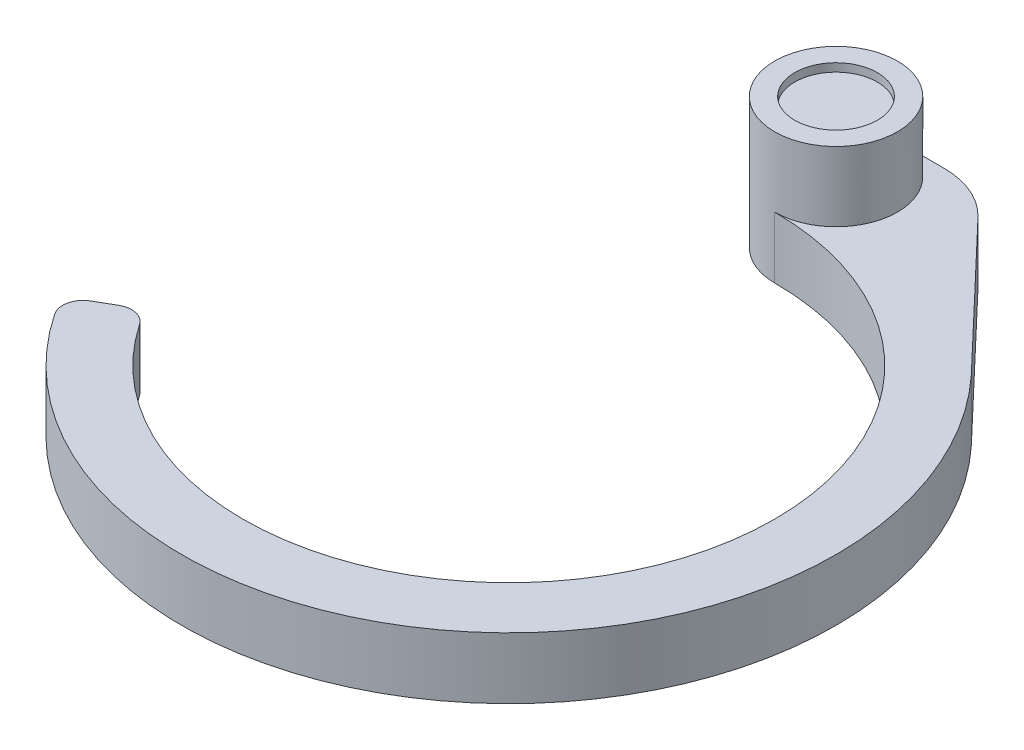
ISO-10303-21;
HEADER;
FILE_DESCRIPTION(('STEP AP214'),'2;1');
FILE_NAME('part.step','',(''),(''),'','','');
FILE_SCHEMA(('AUTOMOTIVE_DESIGN { 1 0 10303 214 1 1 1 1 }'));
ENDSEC;
DATA;
#1=APPLICATION_CONTEXT('core data for automotive mechanical design processes');
#2=APPLICATION_PROTOCOL_DEFINITION('international standard','automotive_design',2000,#1);
#3=PRODUCT_CONTEXT('',#1,'mechanical');
#4=PRODUCT('Part','Part','',(#3));
#5=PRODUCT_RELATED_PRODUCT_CATEGORY('part','',(#4));
#6=PRODUCT_DEFINITION_FORMATION('','',#4);
#7=PRODUCT_DEFINITION_CONTEXT('part definition',#1,'design');
#8=PRODUCT_DEFINITION('design','',#6,#7);
#9=PRODUCT_DEFINITION_SHAPE('','',#8);
#10=(LENGTH_UNIT() NAMED_UNIT(*) SI_UNIT(.MILLI.,.METRE.));
#11=(NAMED_UNIT(*) PLANE_ANGLE_UNIT() SI_UNIT($,.RADIAN.));
#12=(NAMED_UNIT(*) SI_UNIT($,.STERADIAN.) SOLID_ANGLE_UNIT());
#13=UNCERTAINTY_MEASURE_WITH_UNIT(LENGTH_MEASURE(1.E-05),#10,'distance_accuracy_value','');
#14=(GEOMETRIC_REPRESENTATION_CONTEXT(3) GLOBAL_UNCERTAINTY_ASSIGNED_CONTEXT((#13)) GLOBAL_UNIT_ASSIGNED_CONTEXT((#10,
#11,#12)) REPRESENTATION_CONTEXT('',''));
#15=CARTESIAN_POINT('',(0.,0.,0.));
#16=DIRECTION('',(0.,0.,1.));
#17=DIRECTION('',(1.,0.,0.));
#18=AXIS2_PLACEMENT_3D('',#15,#16,#17);
#19=CARTESIAN_POINT('',(-62.3074069840787,15.,41.7467008866615));
#20=DIRECTION('',(0.,-1.,0.));
#21=DIRECTION('',(0.,0.,-1.));
#22=AXIS2_PLACEMENT_3D('',#19,#20,#21);
#23=CYLINDRICAL_SURFACE('',#22,5.00000000000001);
#24=CARTESIAN_POINT('',(-62.3074069840787,0.,41.7467008866615));
#25=DIRECTION('',(0.,1.,0.));
#26=DIRECTION('',(0.,0.,1.));
#27=AXIS2_PLACEMENT_3D('',#24,#25,#26);
#28=CIRCLE('',#27,5.00000000000001);
#29=CARTESIAN_POINT('',(-66.4612341163506,0.,44.5298142791056));
#30=VERTEX_POINT('',#29);
#31=CARTESIAN_POINT('',(-64.8074069840787,0.,37.4165738677393));
#32=VERTEX_POINT('',#31);
#33=EDGE_CURVE('E176',#30,#32,#28,.F.);
#34=ORIENTED_EDGE('',*,*,#33,.F.);
#35=DIRECTION('',(0.,-1.,0.));
#36=VECTOR('',#35,1.);
#37=CARTESIAN_POINT('',(-66.4612341163506,15.,44.5298142791056));
#38=LINE('',#37,#36);
#39=CARTESIAN_POINT('',(-66.4612341163506,15.,44.5298142791056));
#40=VERTEX_POINT('',#39);
#41=EDGE_CURVE('E11',#40,#30,#38,.T.);
#42=ORIENTED_EDGE('',*,*,#41,.F.);
#43=CARTESIAN_POINT('',(-62.3074069840787,15.,41.7467008866615));
#44=DIRECTION('',(0.,1.,0.));
#45=DIRECTION('',(0.,0.,1.));
#46=AXIS2_PLACEMENT_3D('',#43,#44,#45);
#47=CIRCLE('',#46,5.00000000000001);
#48=CARTESIAN_POINT('',(-64.8074069840787,15.,37.4165738677393));
#49=VERTEX_POINT('',#48);
#50=EDGE_CURVE('E193',#40,#49,#47,.F.);
#51=ORIENTED_EDGE('',*,*,#50,.T.);
#52=DIRECTION('',(0.,-1.,0.));
#53=VECTOR('',#52,1.);
#54=CARTESIAN_POINT('',(-64.8074069840787,15.,37.4165738677393));
#55=LINE('',#54,#53);
#56=EDGE_CURVE('E91',#49,#32,#55,.T.);
#57=ORIENTED_EDGE('',*,*,#56,.T.);
#58=EDGE_LOOP('',(#34,#42,#51,#57));
#59=FACE_BOUND('',#58,.T.);
#60=ADVANCED_FACE('F35',(#59),#23,.T.);
#61=CARTESIAN_POINT('',(0.,15.,0.));
#62=DIRECTION('',(0.,-1.,0.));
#63=DIRECTION('',(0.,0.,-1.));
#64=AXIS2_PLACEMENT_3D('',#61,#62,#63);
#65=CYLINDRICAL_SURFACE('',#64,80.);
#66=CARTESIAN_POINT('',(0.,0.,0.));
#67=DIRECTION('',(0.,1.,0.));
#68=DIRECTION('',(0.,0.,1.));
#69=AXIS2_PLACEMENT_3D('',#66,#67,#68);
#70=CIRCLE('',#69,80.);
#71=CARTESIAN_POINT('',(58.5757297296054,0.,-54.4874654085159));
#72=VERTEX_POINT('',#71);
#73=EDGE_CURVE('E172',#30,#72,#70,.T.);
#74=ORIENTED_EDGE('',*,*,#73,.T.);
#75=DIRECTION('',(0.,-1.,0.));
#76=VECTOR('',#75,1.);
#77=CARTESIAN_POINT('',(58.5757297296054,15.,-54.4874654085159));
#78=LINE('',#77,#76);
#79=CARTESIAN_POINT('',(58.5757297296054,15.,-54.4874654085159));
#80=VERTEX_POINT('',#79);
#81=EDGE_CURVE('E44',#80,#72,#78,.T.);
#82=ORIENTED_EDGE('',*,*,#81,.F.);
#83=CARTESIAN_POINT('',(0.,15.,0.));
#84=DIRECTION('',(0.,1.,0.));
#85=DIRECTION('',(0.,0.,1.));
#86=AXIS2_PLACEMENT_3D('',#83,#84,#85);
#87=CIRCLE('',#86,80.);
#88=EDGE_CURVE('E205',#40,#80,#87,.T.);
#89=ORIENTED_EDGE('',*,*,#88,.F.);
#90=ORIENTED_EDGE('',*,*,#41,.T.);
#91=EDGE_LOOP('',(#74,#82,#89,#90));
#92=FACE_BOUND('',#91,.T.);
#93=ADVANCED_FACE('F173',(#92),#65,.T.);
#94=CARTESIAN_POINT('',(57.9325504327501,15.,-55.1629373618664));
#95=DIRECTION('',(0.724206102182212,0.,-0.689583585623996));
#96=DIRECTION('',(-0.689583585623996,0.,-0.724206102182212));
#97=AXIS2_PLACEMENT_3D('',#94,#95,#96);
#98=PLANE('',#97);
#99=DIRECTION('',(0.689583585623996,0.,0.724206102182212));
#100=VECTOR('',#99,1.);
#101=CARTESIAN_POINT('',(57.9325504327501,0.,-55.1629373618664));
#102=LINE('',#101,#100);
#103=CARTESIAN_POINT('',(25.911523347206,0.,-88.7916717124799));
#104=VERTEX_POINT('',#103);
#105=EDGE_CURVE('E166',#104,#72,#102,.T.);
#106=ORIENTED_EDGE('',*,*,#105,.F.);
#107=DIRECTION('',(0.,-1.,0.));
#108=VECTOR('',#107,1.);
#109=CARTESIAN_POINT('',(25.911523347206,15.,-88.7916717124799));
#110=LINE('',#109,#108);
#111=CARTESIAN_POINT('',(25.911523347206,15.,-88.7916717124799));
#112=VERTEX_POINT('',#111);
#113=EDGE_CURVE('E151',#112,#104,#110,.T.);
#114=ORIENTED_EDGE('',*,*,#113,.F.);
#115=DIRECTION('',(0.689583585623996,0.,0.724206102182212));
#116=VECTOR('',#115,1.);
#117=CARTESIAN_POINT('',(57.9325504327501,15.,-55.1629373618664));
#118=LINE('',#117,#116);
#119=EDGE_CURVE('E169',#112,#80,#118,.T.);
#120=ORIENTED_EDGE('',*,*,#119,.T.);
#121=ORIENTED_EDGE('',*,*,#81,.T.);
#122=EDGE_LOOP('',(#106,#114,#120,#121));
#123=FACE_BOUND('',#122,.T.);
#124=ADVANCED_FACE('F164',(#123),#98,.T.);
#125=CARTESIAN_POINT('',(11.4274013035615,15.,-75.));
#126=DIRECTION('',(0.,-1.,0.));
#127=DIRECTION('',(0.,0.,-1.));
#128=AXIS2_PLACEMENT_3D('',#125,#126,#127);
#129=CYLINDRICAL_SURFACE('',#128,20.0000000000001);
#130=CARTESIAN_POINT('',(11.4274013035615,0.,-75.));
#131=DIRECTION('',(0.,1.,0.));
#132=DIRECTION('',(0.,0.,1.));
#133=AXIS2_PLACEMENT_3D('',#130,#131,#132);
#134=CIRCLE('',#133,20.0000000000001);
#135=CARTESIAN_POINT('',(11.4274013035618,0.,-95.));
#136=VERTEX_POINT('',#135);
#137=EDGE_CURVE('E180',#136,#104,#134,.F.);
#138=ORIENTED_EDGE('',*,*,#137,.F.);
#139=DIRECTION('',(0.,-1.,0.));
#140=VECTOR('',#139,1.);
#141=CARTESIAN_POINT('',(11.4274013035618,15.,-95.));
#142=LINE('',#141,#140);
#143=CARTESIAN_POINT('',(11.4274013035618,15.,-95.));
#144=VERTEX_POINT('',#143);
#145=EDGE_CURVE('E146',#144,#136,#142,.T.);
#146=ORIENTED_EDGE('',*,*,#145,.F.);
#147=CARTESIAN_POINT('',(11.4274013035615,15.,-75.));
#148=DIRECTION('',(0.,1.,0.));
#149=DIRECTION('',(0.,0.,1.));
#150=AXIS2_PLACEMENT_3D('',#147,#148,#149);
#151=CIRCLE('',#150,20.0000000000001);
#152=EDGE_CURVE('E135',#144,#112,#151,.F.);
#153=ORIENTED_EDGE('',*,*,#152,.T.);
#154=ORIENTED_EDGE('',*,*,#113,.T.);
#155=EDGE_LOOP('',(#138,#146,#153,#154));
#156=FACE_BOUND('',#155,.T.);
#157=ADVANCED_FACE('F239',(#156),#129,.T.);
#158=CARTESIAN_POINT('',(-1.15370923512719E-13,15.,-95.));
#159=DIRECTION('',(0.,0.,-1.));
#160=DIRECTION('',(-1.,0.,0.));
#161=AXIS2_PLACEMENT_3D('',#158,#159,#160);
#162=PLANE('',#161);
#163=DIRECTION('',(1.,0.,0.));
#164=VECTOR('',#163,1.);
#165=CARTESIAN_POINT('',(-1.15370923512719E-13,0.,-95.));
#166=LINE('',#165,#164);
#167=CARTESIAN_POINT('',(0.,0.,-95.));
#168=VERTEX_POINT('',#167);
#169=EDGE_CURVE('E182',#168,#136,#166,.T.);
#170=ORIENTED_EDGE('',*,*,#169,.F.);
#171=DIRECTION('',(0.,-1.,0.));
#172=VECTOR('',#171,1.);
#173=CARTESIAN_POINT('',(0.,15.,-95.));
#174=LINE('',#173,#172);
#175=CARTESIAN_POINT('',(0.,15.,-95.));
#176=VERTEX_POINT('',#175);
#177=EDGE_CURVE('E142',#176,#168,#174,.T.);
#178=ORIENTED_EDGE('',*,*,#177,.F.);
#179=DIRECTION('',(1.,0.,0.));
#180=VECTOR('',#179,1.);
#181=CARTESIAN_POINT('',(-1.15370923512719E-13,15.,-95.));
#182=LINE('',#181,#180);
#183=EDGE_CURVE('E132',#176,#144,#182,.T.);
#184=ORIENTED_EDGE('',*,*,#183,.T.);
#185=ORIENTED_EDGE('',*,*,#145,.T.);
#186=EDGE_LOOP('',(#170,#178,#184,#185));
#187=FACE_BOUND('',#186,.T.);
#188=ADVANCED_FACE('F232',(#187),#162,.T.);
#189=CARTESIAN_POINT('',(0.,15.,-80.));
#190=DIRECTION('',(0.,-1.,0.));
#191=DIRECTION('',(0.,0.,-1.));
#192=AXIS2_PLACEMENT_3D('',#189,#190,#191);
#193=CYLINDRICAL_SURFACE('',#192,15.);
#194=CARTESIAN_POINT('',(0.,0.,-80.));
#195=DIRECTION('',(0.,1.,0.));
#196=DIRECTION('',(0.,0.,1.));
#197=AXIS2_PLACEMENT_3D('',#194,#195,#196);
#198=CIRCLE('',#197,15.);
#199=CARTESIAN_POINT('',(0.,0.,-65.));
#200=VERTEX_POINT('',#199);
#201=EDGE_CURVE('E187',#168,#200,#198,.T.);
#202=ORIENTED_EDGE('',*,*,#201,.T.);
#203=DIRECTION('',(0.,-1.,0.));
#204=VECTOR('',#203,1.);
#205=CARTESIAN_POINT('',(0.,15.,-65.));
#206=LINE('',#205,#204);
#207=CARTESIAN_POINT('',(0.,15.,-65.));
#208=VERTEX_POINT('',#207);
#209=EDGE_CURVE('E121',#208,#200,#206,.T.);
#210=ORIENTED_EDGE('',*,*,#209,.F.);
#211=CARTESIAN_POINT('',(0.,15.,-80.));
#212=DIRECTION('',(0.,1.,0.));
#213=DIRECTION('',(0.,0.,1.));
#214=AXIS2_PLACEMENT_3D('',#211,#212,#213);
#215=CIRCLE('',#214,15.);
#216=EDGE_CURVE('E131',#208,#176,#215,.T.);
#217=ORIENTED_EDGE('',*,*,#216,.T.);
#218=ORIENTED_EDGE('',*,*,#177,.T.);
#219=EDGE_LOOP('',(#202,#210,#217,#218));
#220=FACE_BOUND('',#219,.T.);
#221=CARTESIAN_POINT('',(0.,32.,-80.));
#222=DIRECTION('',(0.,1.,0.));
#223=DIRECTION('',(0.,0.,1.));
#224=AXIS2_PLACEMENT_3D('',#221,#222,#223);
#225=CIRCLE('',#224,15.);
#226=CARTESIAN_POINT('',(0.,32.,-65.));
#227=VERTEX_POINT('',#226);
#228=EDGE_CURVE('E197',#227,#227,#225,.T.);
#229=ORIENTED_EDGE('',*,*,#228,.F.);
#230=EDGE_LOOP('',(#229));
#231=FACE_BOUND('',#230,.T.);
#232=ADVANCED_FACE('F230',(#220,#231),#193,.T.);
#233=CARTESIAN_POINT('',(0.,15.,0.));
#234=DIRECTION('',(0.,-1.,0.));
#235=DIRECTION('',(0.,0.,-1.));
#236=AXIS2_PLACEMENT_3D('',#233,#234,#235);
#237=CYLINDRICAL_SURFACE('',#236,65.);
#238=CARTESIAN_POINT('',(0.,0.,0.));
#239=DIRECTION('',(0.,1.,0.));
#240=DIRECTION('',(0.,0.,1.));
#241=AXIS2_PLACEMENT_3D('',#238,#239,#240);
#242=CIRCLE('',#241,65.);
#243=CARTESIAN_POINT('',(-53.8264378899364,0.,36.4378180477484));
#244=VERTEX_POINT('',#243);
#245=EDGE_CURVE('E120',#244,#200,#242,.T.);
#246=ORIENTED_EDGE('',*,*,#245,.F.);
#247=DIRECTION('',(0.,-1.,0.));
#248=VECTOR('',#247,1.);
#249=CARTESIAN_POINT('',(-53.8264378899364,15.,36.4378180477484));
#250=LINE('',#249,#248);
#251=CARTESIAN_POINT('',(-53.8264378899364,15.,36.4378180477484));
#252=VERTEX_POINT('',#251);
#253=EDGE_CURVE('E113',#252,#244,#250,.T.);
#254=ORIENTED_EDGE('',*,*,#253,.F.);
#255=CARTESIAN_POINT('',(0.,15.,0.));
#256=DIRECTION('',(0.,1.,0.));
#257=DIRECTION('',(0.,0.,1.));
#258=AXIS2_PLACEMENT_3D('',#255,#256,#257);
#259=CIRCLE('',#258,65.);
#260=EDGE_CURVE('E117',#252,#208,#259,.T.);
#261=ORIENTED_EDGE('',*,*,#260,.T.);
#262=ORIENTED_EDGE('',*,*,#209,.T.);
#263=EDGE_LOOP('',(#246,#254,#261,#262));
#264=FACE_BOUND('',#263,.T.);
#265=ADVANCED_FACE('F115',(#264),#237,.F.);
#266=CARTESIAN_POINT('',(-57.9669331122392,15.,39.2407271283444));
#267=DIRECTION('',(0.,-1.,0.));
#268=DIRECTION('',(0.,0.,-1.));
#269=AXIS2_PLACEMENT_3D('',#266,#267,#268);
#270=CYLINDRICAL_SURFACE('',#269,5.);
#271=CARTESIAN_POINT('',(-57.9669331122392,0.,39.2407271283444));
#272=DIRECTION('',(0.,1.,0.));
#273=DIRECTION('',(0.,0.,1.));
#274=AXIS2_PLACEMENT_3D('',#271,#272,#273);
#275=CIRCLE('',#274,5.);
#276=CARTESIAN_POINT('',(-60.4669331122392,0.,34.9106001094222));
#277=VERTEX_POINT('',#276);
#278=EDGE_CURVE('E84',#244,#277,#275,.T.);
#279=ORIENTED_EDGE('',*,*,#278,.T.);
#280=DIRECTION('',(0.,-1.,0.));
#281=VECTOR('',#280,1.);
#282=CARTESIAN_POINT('',(-60.4669331122392,15.,34.9106001094222));
#283=LINE('',#282,#281);
#284=CARTESIAN_POINT('',(-60.4669331122392,15.,34.9106001094222));
#285=VERTEX_POINT('',#284);
#286=EDGE_CURVE('E122',#285,#277,#283,.T.);
#287=ORIENTED_EDGE('',*,*,#286,.F.);
#288=CARTESIAN_POINT('',(-57.9669331122392,15.,39.2407271283444));
#289=DIRECTION('',(0.,1.,0.));
#290=DIRECTION('',(0.,0.,1.));
#291=AXIS2_PLACEMENT_3D('',#288,#289,#290);
#292=CIRCLE('',#291,5.);
#293=EDGE_CURVE('E124',#252,#285,#292,.T.);
#294=ORIENTED_EDGE('',*,*,#293,.F.);
#295=ORIENTED_EDGE('',*,*,#253,.T.);
#296=EDGE_LOOP('',(#279,#287,#294,#295));
#297=FACE_BOUND('',#296,.T.);
#298=ADVANCED_FACE('F125',(#297),#270,.T.);
#299=CARTESIAN_POINT('',(0.,15.,0.));
#300=DIRECTION('',(0.499999999999997,0.,0.86602540378444));
#301=DIRECTION('',(0.86602540378444,0.,-0.499999999999997));
#302=AXIS2_PLACEMENT_3D('',#299,#300,#301);
#303=PLANE('',#302);
#304=DIRECTION('',(-0.86602540378444,0.,0.499999999999997));
#305=VECTOR('',#304,1.);
#306=CARTESIAN_POINT('',(0.,0.,0.));
#307=LINE('',#306,#305);
#308=EDGE_CURVE('E191',#277,#32,#307,.T.);
#309=ORIENTED_EDGE('',*,*,#308,.T.);
#310=ORIENTED_EDGE('',*,*,#56,.F.);
#311=DIRECTION('',(-0.86602540378444,0.,0.499999999999997));
#312=VECTOR('',#311,1.);
#313=CARTESIAN_POINT('',(0.,15.,0.));
#314=LINE('',#313,#312);
#315=EDGE_CURVE('E53',#285,#49,#314,.T.);
#316=ORIENTED_EDGE('',*,*,#315,.F.);
#317=ORIENTED_EDGE('',*,*,#286,.T.);
#318=EDGE_LOOP('',(#309,#310,#316,#317));
#319=FACE_BOUND('',#318,.T.);
#320=ADVANCED_FACE('F196',(#319),#303,.F.);
#321=CARTESIAN_POINT('',(0.,15.,0.));
#322=DIRECTION('',(0.,1.,0.));
#323=DIRECTION('',(0.,0.,1.));
#324=AXIS2_PLACEMENT_3D('',#321,#322,#323);
#325=PLANE('',#324);
#326=ORIENTED_EDGE('',*,*,#216,.F.);
#327=ORIENTED_EDGE('',*,*,#260,.F.);
#328=ORIENTED_EDGE('',*,*,#293,.T.);
#329=ORIENTED_EDGE('',*,*,#315,.T.);
#330=ORIENTED_EDGE('',*,*,#50,.F.);
#331=ORIENTED_EDGE('',*,*,#88,.T.);
#332=ORIENTED_EDGE('',*,*,#119,.F.);
#333=ORIENTED_EDGE('',*,*,#152,.F.);
#334=ORIENTED_EDGE('',*,*,#183,.F.);
#335=EDGE_LOOP('',(#326,#327,#328,#329,#330,#331,#332,#333,#334));
#336=FACE_BOUND('',#335,.T.);
#337=ADVANCED_FACE('F128',(#336),#325,.T.);
#338=CARTESIAN_POINT('',(0.,0.,0.));
#339=DIRECTION('',(0.,1.,0.));
#340=DIRECTION('',(0.,0.,1.));
#341=AXIS2_PLACEMENT_3D('',#338,#339,#340);
#342=PLANE('',#341);
#343=ORIENTED_EDGE('',*,*,#33,.T.);
#344=ORIENTED_EDGE('',*,*,#308,.F.);
#345=ORIENTED_EDGE('',*,*,#278,.F.);
#346=ORIENTED_EDGE('',*,*,#245,.T.);
#347=ORIENTED_EDGE('',*,*,#201,.F.);
#348=ORIENTED_EDGE('',*,*,#169,.T.);
#349=ORIENTED_EDGE('',*,*,#137,.T.);
#350=ORIENTED_EDGE('',*,*,#105,.T.);
#351=ORIENTED_EDGE('',*,*,#73,.F.);
#352=EDGE_LOOP('',(#343,#344,#345,#346,#347,#348,#349,#350,#351));
#353=FACE_BOUND('',#352,.T.);
#354=ADVANCED_FACE('F178',(#353),#342,.F.);
#355=CARTESIAN_POINT('',(0.,32.,-80.));
#356=DIRECTION('',(0.,1.,0.));
#357=DIRECTION('',(0.,0.,1.));
#358=AXIS2_PLACEMENT_3D('',#355,#356,#357);
#359=PLANE('',#358);
#360=CARTESIAN_POINT('',(0.,32.,-80.));
#361=DIRECTION('',(0.,1.,0.));
#362=DIRECTION('',(0.,0.,1.));
#363=AXIS2_PLACEMENT_3D('',#360,#361,#362);
#364=CIRCLE('',#363,10.1);
#365=CARTESIAN_POINT('',(0.,32.,-69.9));
#366=VERTEX_POINT('',#365);
#367=EDGE_CURVE('E210',#366,#366,#364,.T.);
#368=ORIENTED_EDGE('',*,*,#367,.F.);
#369=EDGE_LOOP('',(#368));
#370=FACE_BOUND('',#369,.T.);
#371=ORIENTED_EDGE('',*,*,#228,.T.);
#372=EDGE_LOOP('',(#371));
#373=FACE_BOUND('',#372,.T.);
#374=ADVANCED_FACE('F221',(#370,#373),#359,.T.);
#375=CARTESIAN_POINT('',(0.,30.,-80.));
#376=DIRECTION('',(0.,1.,0.));
#377=DIRECTION('',(0.,0.,1.));
#378=AXIS2_PLACEMENT_3D('',#375,#376,#377);
#379=CYLINDRICAL_SURFACE('',#378,10.1);
#380=CARTESIAN_POINT('',(0.,30.,-80.));
#381=DIRECTION('',(0.,1.,0.));
#382=DIRECTION('',(0.,0.,1.));
#383=AXIS2_PLACEMENT_3D('',#380,#381,#382);
#384=CIRCLE('',#383,10.1);
#385=CARTESIAN_POINT('',(0.,30.,-69.9));
#386=VERTEX_POINT('',#385);
#387=EDGE_CURVE('E208',#386,#386,#384,.T.);
#388=ORIENTED_EDGE('',*,*,#387,.F.);
#389=EDGE_LOOP('',(#388));
#390=FACE_BOUND('',#389,.T.);
#391=ORIENTED_EDGE('',*,*,#367,.T.);
#392=EDGE_LOOP('',(#391));
#393=FACE_BOUND('',#392,.T.);
#394=ADVANCED_FACE('F218',(#390,#393),#379,.F.);
#395=CARTESIAN_POINT('',(0.,30.,-80.));
#396=DIRECTION('',(0.,1.,0.));
#397=DIRECTION('',(0.,0.,1.));
#398=AXIS2_PLACEMENT_3D('',#395,#396,#397);
#399=PLANE('',#398);
#400=ORIENTED_EDGE('',*,*,#387,.T.);
#401=EDGE_LOOP('',(#400));
#402=FACE_BOUND('',#401,.T.);
#403=ADVANCED_FACE('F216',(#402),#399,.T.);
#404=CLOSED_SHELL('',(#60,#93,#124,#157,#188,#232,#265,#298,#320,#337,#354,#374,#394,#403));
#405=MANIFOLD_SOLID_BREP('B2',#404);
#406=ADVANCED_BREP_SHAPE_REPRESENTATION('',(#18,#405),#14);
#407=SHAPE_DEFINITION_REPRESENTATION(#9,#406);
ENDSEC;
END-ISO-10303-21;
